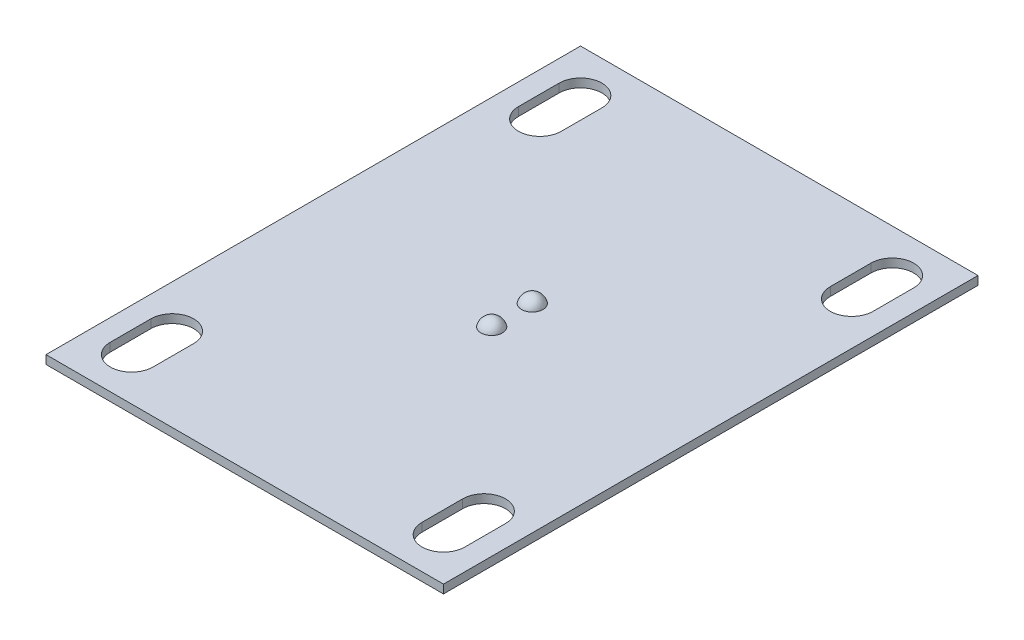
ISO-10303-21;
HEADER;
FILE_DESCRIPTION(('STEP AP214'),'2;1');
FILE_NAME('part.step','',(''),(''),'','','');
FILE_SCHEMA(('AUTOMOTIVE_DESIGN { 1 0 10303 214 1 1 1 1 }'));
ENDSEC;
DATA;
#1=APPLICATION_CONTEXT('core data for automotive mechanical design processes');
#2=APPLICATION_PROTOCOL_DEFINITION('international standard','automotive_design',2000,#1);
#3=PRODUCT_CONTEXT('',#1,'mechanical');
#4=PRODUCT('Part','Part','',(#3));
#5=PRODUCT_RELATED_PRODUCT_CATEGORY('part','',(#4));
#6=PRODUCT_DEFINITION_FORMATION('','',#4);
#7=PRODUCT_DEFINITION_CONTEXT('part definition',#1,'design');
#8=PRODUCT_DEFINITION('design','',#6,#7);
#9=PRODUCT_DEFINITION_SHAPE('','',#8);
#10=(LENGTH_UNIT() NAMED_UNIT(*) SI_UNIT(.MILLI.,.METRE.));
#11=(NAMED_UNIT(*) PLANE_ANGLE_UNIT() SI_UNIT($,.RADIAN.));
#12=(NAMED_UNIT(*) SI_UNIT($,.STERADIAN.) SOLID_ANGLE_UNIT());
#13=UNCERTAINTY_MEASURE_WITH_UNIT(LENGTH_MEASURE(1.E-05),#10,'distance_accuracy_value','');
#14=(GEOMETRIC_REPRESENTATION_CONTEXT(3) GLOBAL_UNCERTAINTY_ASSIGNED_CONTEXT((#13)) GLOBAL_UNIT_ASSIGNED_CONTEXT((#10,
#11,#12)) REPRESENTATION_CONTEXT('',''));
#15=CARTESIAN_POINT('',(0.,0.,0.));
#16=DIRECTION('',(0.,0.,1.));
#17=DIRECTION('',(1.,0.,0.));
#18=AXIS2_PLACEMENT_3D('',#15,#16,#17);
#19=CARTESIAN_POINT('',(0.,-4.3,0.));
#20=DIRECTION('',(0.,-1.,0.));
#21=DIRECTION('',(0.,0.,-1.));
#22=AXIS2_PLACEMENT_3D('',#19,#20,#21);
#23=PLANE('',#22);
#24=CARTESIAN_POINT('',(-35.4,-4.30000000000003,-37.0487989725326));
#25=DIRECTION('',(0.,1.,0.));
#26=DIRECTION('',(0.,0.,1.));
#27=AXIS2_PLACEMENT_3D('',#24,#25,#26);
#28=CIRCLE('',#27,5.);
#29=CARTESIAN_POINT('',(-30.4,-4.30000000000003,-37.0487989725326));
#30=VERTEX_POINT('',#29);
#31=CARTESIAN_POINT('',(-40.4,-4.30000000000003,-37.0487989725326));
#32=VERTEX_POINT('',#31);
#33=EDGE_CURVE('E236',#30,#32,#28,.T.);
#34=ORIENTED_EDGE('',*,*,#33,.T.);
#35=DIRECTION('',(0.,0.,1.));
#36=VECTOR('',#35,1.);
#37=CARTESIAN_POINT('',(-40.4,-4.30000000000003,-37.0487989725326));
#38=LINE('',#37,#36);
#39=CARTESIAN_POINT('',(-40.4,-4.3,-27.5655854825326));
#40=VERTEX_POINT('',#39);
#41=EDGE_CURVE('E239',#32,#40,#38,.T.);
#42=ORIENTED_EDGE('',*,*,#41,.T.);
#43=CARTESIAN_POINT('',(-35.4,-4.30000000000003,-27.5655854825326));
#44=DIRECTION('',(0.,1.,0.));
#45=DIRECTION('',(0.,0.,1.));
#46=AXIS2_PLACEMENT_3D('',#43,#44,#45);
#47=CIRCLE('',#46,5.00000000000001);
#48=CARTESIAN_POINT('',(-30.4,-4.30000000000003,-27.5655854825326));
#49=VERTEX_POINT('',#48);
#50=EDGE_CURVE('E243',#40,#49,#47,.T.);
#51=ORIENTED_EDGE('',*,*,#50,.T.);
#52=DIRECTION('',(0.,0.,-1.));
#53=VECTOR('',#52,1.);
#54=CARTESIAN_POINT('',(-30.4,-4.30000000000003,-37.0487989725326));
#55=LINE('',#54,#53);
#56=EDGE_CURVE('E246',#49,#30,#55,.T.);
#57=ORIENTED_EDGE('',*,*,#56,.T.);
#58=EDGE_LOOP('',(#34,#42,#51,#57));
#59=FACE_BOUND('',#58,.T.);
#60=CARTESIAN_POINT('',(-35.4,-4.30000000000001,58.2679875374674));
#61=DIRECTION('',(0.,1.,0.));
#62=DIRECTION('',(0.,0.,1.));
#63=AXIS2_PLACEMENT_3D('',#60,#61,#62);
#64=CIRCLE('',#63,5.);
#65=CARTESIAN_POINT('',(-30.4,-4.30000000000001,58.2679875374674));
#66=VERTEX_POINT('',#65);
#67=CARTESIAN_POINT('',(-40.4,-4.30000000000001,58.2679875374674));
#68=VERTEX_POINT('',#67);
#69=EDGE_CURVE('E270',#66,#68,#64,.T.);
#70=ORIENTED_EDGE('',*,*,#69,.T.);
#71=DIRECTION('',(0.,0.,1.));
#72=VECTOR('',#71,1.);
#73=CARTESIAN_POINT('',(-40.4,-4.30000000000001,58.2679875374674));
#74=LINE('',#73,#72);
#75=CARTESIAN_POINT('',(-40.4,-4.29999999999998,67.7512010274674));
#76=VERTEX_POINT('',#75);
#77=EDGE_CURVE('E273',#68,#76,#74,.T.);
#78=ORIENTED_EDGE('',*,*,#77,.T.);
#79=CARTESIAN_POINT('',(-35.4,-4.30000000000001,67.7512010274674));
#80=DIRECTION('',(0.,1.,0.));
#81=DIRECTION('',(0.,0.,1.));
#82=AXIS2_PLACEMENT_3D('',#79,#80,#81);
#83=CIRCLE('',#82,5.);
#84=CARTESIAN_POINT('',(-30.4,-4.30000000000001,67.7512010274674));
#85=VERTEX_POINT('',#84);
#86=EDGE_CURVE('E277',#76,#85,#83,.T.);
#87=ORIENTED_EDGE('',*,*,#86,.T.);
#88=DIRECTION('',(0.,0.,-1.));
#89=VECTOR('',#88,1.);
#90=CARTESIAN_POINT('',(-30.4,-4.30000000000001,58.2679875374674));
#91=LINE('',#90,#89);
#92=EDGE_CURVE('E280',#85,#66,#91,.T.);
#93=ORIENTED_EDGE('',*,*,#92,.T.);
#94=EDGE_LOOP('',(#70,#78,#87,#93));
#95=FACE_BOUND('',#94,.T.);
#96=DIRECTION('',(0.,0.,-1.));
#97=VECTOR('',#96,1.);
#98=CARTESIAN_POINT('',(-45.4,-4.29999999999998,77.7512010274674));
#99=LINE('',#98,#97);
#100=CARTESIAN_POINT('',(-45.4,-4.29999999999998,77.7512010274674));
#101=VERTEX_POINT('',#100);
#102=CARTESIAN_POINT('',(-45.4,-4.30000000000001,-47.0487989725326));
#103=VERTEX_POINT('',#102);
#104=EDGE_CURVE('E303',#101,#103,#99,.T.);
#105=ORIENTED_EDGE('',*,*,#104,.T.);
#106=DIRECTION('',(1.,0.,0.));
#107=VECTOR('',#106,1.);
#108=CARTESIAN_POINT('',(-45.4,-4.30000000000001,-47.0487989725326));
#109=LINE('',#108,#107);
#110=CARTESIAN_POINT('',(47.4,-4.30000000000001,-47.0487989725326));
#111=VERTEX_POINT('',#110);
#112=EDGE_CURVE('E306',#103,#111,#109,.T.);
#113=ORIENTED_EDGE('',*,*,#112,.T.);
#114=DIRECTION('',(0.,0.,1.));
#115=VECTOR('',#114,1.);
#116=CARTESIAN_POINT('',(47.4,-4.29999999999998,77.7512010274674));
#117=LINE('',#116,#115);
#118=CARTESIAN_POINT('',(47.4,-4.29999999999998,77.7512010274674));
#119=VERTEX_POINT('',#118);
#120=EDGE_CURVE('E309',#111,#119,#117,.T.);
#121=ORIENTED_EDGE('',*,*,#120,.T.);
#122=DIRECTION('',(-1.,0.,0.));
#123=VECTOR('',#122,1.);
#124=CARTESIAN_POINT('',(-45.4,-4.29999999999998,77.7512010274674));
#125=LINE('',#124,#123);
#126=EDGE_CURVE('E311',#119,#101,#125,.T.);
#127=ORIENTED_EDGE('',*,*,#126,.T.);
#128=EDGE_LOOP('',(#105,#113,#121,#127));
#129=FACE_BOUND('',#128,.T.);
#130=DIRECTION('',(0.,0.,1.));
#131=VECTOR('',#130,1.);
#132=CARTESIAN_POINT('',(42.3999999999999,-4.30000000000004,58.2679875374674));
#133=LINE('',#132,#131);
#134=CARTESIAN_POINT('',(42.3999999999999,-4.30000000000004,58.2679875374674));
#135=VERTEX_POINT('',#134);
#136=CARTESIAN_POINT('',(42.3999999999999,-4.30000000000004,67.7512010274674));
#137=VERTEX_POINT('',#136);
#138=EDGE_CURVE('E215',#135,#137,#133,.T.);
#139=ORIENTED_EDGE('',*,*,#138,.F.);
#140=CARTESIAN_POINT('',(37.3999999999999,-4.30000000000004,58.2679875374674));
#141=DIRECTION('',(0.,-1.,0.));
#142=DIRECTION('',(0.,0.,1.));
#143=AXIS2_PLACEMENT_3D('',#140,#141,#142);
#144=CIRCLE('',#143,5.);
#145=CARTESIAN_POINT('',(32.3999999999999,-4.30000000000004,58.2679875374674));
#146=VERTEX_POINT('',#145);
#147=EDGE_CURVE('E208',#146,#135,#144,.T.);
#148=ORIENTED_EDGE('',*,*,#147,.F.);
#149=DIRECTION('',(0.,0.,-1.));
#150=VECTOR('',#149,1.);
#151=CARTESIAN_POINT('',(32.3999999999999,-4.30000000000004,58.2679875374674));
#152=LINE('',#151,#150);
#153=CARTESIAN_POINT('',(32.3999999999999,-4.29999999999998,67.7512010274674));
#154=VERTEX_POINT('',#153);
#155=EDGE_CURVE('E210',#154,#146,#152,.T.);
#156=ORIENTED_EDGE('',*,*,#155,.F.);
#157=CARTESIAN_POINT('',(37.3999999999999,-4.30000000000004,67.7512010274674));
#158=DIRECTION('',(0.,-1.,0.));
#159=DIRECTION('',(0.,0.,1.));
#160=AXIS2_PLACEMENT_3D('',#157,#158,#159);
#161=CIRCLE('',#160,5.);
#162=EDGE_CURVE('E213',#137,#154,#161,.T.);
#163=ORIENTED_EDGE('',*,*,#162,.F.);
#164=EDGE_LOOP('',(#139,#148,#156,#163));
#165=FACE_BOUND('',#164,.T.);
#166=DIRECTION('',(0.,0.,1.));
#167=VECTOR('',#166,1.);
#168=CARTESIAN_POINT('',(42.3999999999999,-4.30000000000006,-37.0487989725326));
#169=LINE('',#168,#167);
#170=CARTESIAN_POINT('',(42.3999999999999,-4.30000000000006,-37.0487989725326));
#171=VERTEX_POINT('',#170);
#172=CARTESIAN_POINT('',(42.3999999999999,-4.30000000000006,-27.5655854825326));
#173=VERTEX_POINT('',#172);
#174=EDGE_CURVE('E185',#171,#173,#169,.T.);
#175=ORIENTED_EDGE('',*,*,#174,.F.);
#176=CARTESIAN_POINT('',(37.3999999999999,-4.30000000000006,-37.0487989725326));
#177=DIRECTION('',(0.,-1.,0.));
#178=DIRECTION('',(0.,0.,1.));
#179=AXIS2_PLACEMENT_3D('',#176,#177,#178);
#180=CIRCLE('',#179,5.);
#181=CARTESIAN_POINT('',(32.3999999999999,-4.30000000000006,-37.0487989725326));
#182=VERTEX_POINT('',#181);
#183=EDGE_CURVE('E177',#182,#171,#180,.T.);
#184=ORIENTED_EDGE('',*,*,#183,.F.);
#185=DIRECTION('',(0.,0.,-1.));
#186=VECTOR('',#185,1.);
#187=CARTESIAN_POINT('',(32.3999999999999,-4.30000000000006,-37.0487989725326));
#188=LINE('',#187,#186);
#189=CARTESIAN_POINT('',(32.3999999999999,-4.3,-27.5655854825326));
#190=VERTEX_POINT('',#189);
#191=EDGE_CURVE('E168',#190,#182,#188,.T.);
#192=ORIENTED_EDGE('',*,*,#191,.F.);
#193=CARTESIAN_POINT('',(37.3999999999999,-4.30000000000006,-27.5655854825326));
#194=DIRECTION('',(0.,-1.,0.));
#195=DIRECTION('',(0.,0.,1.));
#196=AXIS2_PLACEMENT_3D('',#193,#194,#195);
#197=CIRCLE('',#196,5.00000000000001);
#198=EDGE_CURVE('E176',#173,#190,#197,.T.);
#199=ORIENTED_EDGE('',*,*,#198,.F.);
#200=EDGE_LOOP('',(#175,#184,#192,#199));
#201=FACE_BOUND('',#200,.T.);
#202=ADVANCED_FACE('F32',(#59,#95,#129,#165,#201),#23,.T.);
#203=CARTESIAN_POINT('',(0.,-2.3,0.));
#204=DIRECTION('',(0.,-1.,0.));
#205=DIRECTION('',(0.,0.,-1.));
#206=AXIS2_PLACEMENT_3D('',#203,#204,#205);
#207=PLANE('',#206);
#208=CARTESIAN_POINT('',(37.3999999999999,-2.29999999999999,58.2679875374674));
#209=DIRECTION('',(0.,-1.,0.));
#210=DIRECTION('',(0.,0.,1.));
#211=AXIS2_PLACEMENT_3D('',#208,#209,#210);
#212=CIRCLE('',#211,5.);
#213=CARTESIAN_POINT('',(32.3999999999999,-2.29999999999999,58.2679875374674));
#214=VERTEX_POINT('',#213);
#215=CARTESIAN_POINT('',(42.3999999999999,-2.29999999999999,58.2679875374674));
#216=VERTEX_POINT('',#215);
#217=EDGE_CURVE('E218',#214,#216,#212,.T.);
#218=ORIENTED_EDGE('',*,*,#217,.T.);
#219=DIRECTION('',(0.,0.,1.));
#220=VECTOR('',#219,1.);
#221=CARTESIAN_POINT('',(42.3999999999999,-2.29999999999999,58.2679875374674));
#222=LINE('',#221,#220);
#223=CARTESIAN_POINT('',(42.3999999999999,-2.29999999999998,67.7512010274674));
#224=VERTEX_POINT('',#223);
#225=EDGE_CURVE('E211',#216,#224,#222,.T.);
#226=ORIENTED_EDGE('',*,*,#225,.T.);
#227=CARTESIAN_POINT('',(37.3999999999999,-2.29999999999998,67.7512010274674));
#228=DIRECTION('',(0.,-1.,0.));
#229=DIRECTION('',(0.,0.,1.));
#230=AXIS2_PLACEMENT_3D('',#227,#228,#229);
#231=CIRCLE('',#230,5.);
#232=CARTESIAN_POINT('',(32.3999999999999,-2.29999999999998,67.7512010274674));
#233=VERTEX_POINT('',#232);
#234=EDGE_CURVE('E224',#224,#233,#231,.T.);
#235=ORIENTED_EDGE('',*,*,#234,.T.);
#236=DIRECTION('',(0.,0.,-1.));
#237=VECTOR('',#236,1.);
#238=CARTESIAN_POINT('',(32.3999999999999,-2.29999999999999,58.2679875374674));
#239=LINE('',#238,#237);
#240=EDGE_CURVE('E221',#233,#214,#239,.T.);
#241=ORIENTED_EDGE('',*,*,#240,.T.);
#242=EDGE_LOOP('',(#218,#226,#235,#241));
#243=FACE_BOUND('',#242,.T.);
#244=DIRECTION('',(0.,0.,1.));
#245=VECTOR('',#244,1.);
#246=CARTESIAN_POINT('',(-40.4,-2.30000000000001,-37.0487989725326));
#247=LINE('',#246,#245);
#248=CARTESIAN_POINT('',(-40.4,-2.30000000000001,-37.0487989725326));
#249=VERTEX_POINT('',#248);
#250=CARTESIAN_POINT('',(-40.4,-2.3,-27.5655854825326));
#251=VERTEX_POINT('',#250);
#252=EDGE_CURVE('E252',#249,#251,#247,.T.);
#253=ORIENTED_EDGE('',*,*,#252,.F.);
#254=CARTESIAN_POINT('',(-35.4,-2.30000000000001,-37.0487989725326));
#255=DIRECTION('',(0.,1.,0.));
#256=DIRECTION('',(0.,0.,1.));
#257=AXIS2_PLACEMENT_3D('',#254,#255,#256);
#258=CIRCLE('',#257,5.);
#259=CARTESIAN_POINT('',(-30.4,-2.30000000000001,-37.0487989725326));
#260=VERTEX_POINT('',#259);
#261=EDGE_CURVE('E250',#260,#249,#258,.T.);
#262=ORIENTED_EDGE('',*,*,#261,.F.);
#263=DIRECTION('',(0.,0.,-1.));
#264=VECTOR('',#263,1.);
#265=CARTESIAN_POINT('',(-30.4,-2.30000000000001,-37.0487989725326));
#266=LINE('',#265,#264);
#267=CARTESIAN_POINT('',(-30.4,-2.3,-27.5655854825326));
#268=VERTEX_POINT('',#267);
#269=EDGE_CURVE('E240',#268,#260,#266,.T.);
#270=ORIENTED_EDGE('',*,*,#269,.F.);
#271=CARTESIAN_POINT('',(-35.4,-2.3,-27.5655854825326));
#272=DIRECTION('',(0.,1.,0.));
#273=DIRECTION('',(0.,0.,1.));
#274=AXIS2_PLACEMENT_3D('',#271,#272,#273);
#275=CIRCLE('',#274,5.00000000000001);
#276=EDGE_CURVE('E256',#251,#268,#275,.T.);
#277=ORIENTED_EDGE('',*,*,#276,.F.);
#278=EDGE_LOOP('',(#253,#262,#270,#277));
#279=FACE_BOUND('',#278,.T.);
#280=DIRECTION('',(0.,0.,1.));
#281=VECTOR('',#280,1.);
#282=CARTESIAN_POINT('',(-40.4,-2.29999999999999,58.2679875374674));
#283=LINE('',#282,#281);
#284=CARTESIAN_POINT('',(-40.4,-2.29999999999999,58.2679875374674));
#285=VERTEX_POINT('',#284);
#286=CARTESIAN_POINT('',(-40.4,-2.29999999999998,67.7512010274674));
#287=VERTEX_POINT('',#286);
#288=EDGE_CURVE('E285',#285,#287,#283,.T.);
#289=ORIENTED_EDGE('',*,*,#288,.F.);
#290=CARTESIAN_POINT('',(-35.4,-2.29999999999999,58.2679875374674));
#291=DIRECTION('',(0.,1.,0.));
#292=DIRECTION('',(0.,0.,1.));
#293=AXIS2_PLACEMENT_3D('',#290,#291,#292);
#294=CIRCLE('',#293,5.);
#295=CARTESIAN_POINT('',(-30.4,-2.29999999999999,58.2679875374674));
#296=VERTEX_POINT('',#295);
#297=EDGE_CURVE('E204',#296,#285,#294,.T.);
#298=ORIENTED_EDGE('',*,*,#297,.F.);
#299=DIRECTION('',(0.,0.,-1.));
#300=VECTOR('',#299,1.);
#301=CARTESIAN_POINT('',(-30.4,-2.29999999999999,58.2679875374674));
#302=LINE('',#301,#300);
#303=CARTESIAN_POINT('',(-30.4,-2.29999999999998,67.7512010274674));
#304=VERTEX_POINT('',#303);
#305=EDGE_CURVE('E274',#304,#296,#302,.T.);
#306=ORIENTED_EDGE('',*,*,#305,.F.);
#307=CARTESIAN_POINT('',(-35.4,-2.29999999999998,67.7512010274674));
#308=DIRECTION('',(0.,1.,0.));
#309=DIRECTION('',(0.,0.,1.));
#310=AXIS2_PLACEMENT_3D('',#307,#308,#309);
#311=CIRCLE('',#310,5.);
#312=EDGE_CURVE('E288',#287,#304,#311,.T.);
#313=ORIENTED_EDGE('',*,*,#312,.F.);
#314=EDGE_LOOP('',(#289,#298,#306,#313));
#315=FACE_BOUND('',#314,.T.);
#316=CARTESIAN_POINT('',(0.999999999999934,-2.29999999999999,20.10120103));
#317=DIRECTION('',(0.,-1.,0.));
#318=DIRECTION('',(0.,0.,-1.));
#319=AXIS2_PLACEMENT_3D('',#316,#317,#318);
#320=CIRCLE('',#319,2.5);
#321=CARTESIAN_POINT('',(0.999999999999934,-2.29999999999999,17.60120103));
#322=VERTEX_POINT('',#321);
#323=EDGE_CURVE('E11',#322,#322,#320,.F.);
#324=ORIENTED_EDGE('',*,*,#323,.F.);
#325=EDGE_LOOP('',(#324));
#326=FACE_BOUND('',#325,.T.);
#327=CARTESIAN_POINT('',(0.999999999999933,-2.3,10.61798754));
#328=DIRECTION('',(0.,1.,0.));
#329=DIRECTION('',(0.,0.,1.));
#330=AXIS2_PLACEMENT_3D('',#327,#328,#329);
#331=CIRCLE('',#330,2.5);
#332=CARTESIAN_POINT('',(0.999999999999933,-2.3,13.11798754));
#333=VERTEX_POINT('',#332);
#334=EDGE_CURVE('E263',#333,#333,#331,.T.);
#335=ORIENTED_EDGE('',*,*,#334,.F.);
#336=EDGE_LOOP('',(#335));
#337=FACE_BOUND('',#336,.T.);
#338=DIRECTION('',(0.,0.,-1.));
#339=VECTOR('',#338,1.);
#340=CARTESIAN_POINT('',(-45.4,-2.29999999999998,77.7512010274674));
#341=LINE('',#340,#339);
#342=CARTESIAN_POINT('',(-45.4,-2.29999999999998,77.7512010274674));
#343=VERTEX_POINT('',#342);
#344=CARTESIAN_POINT('',(-45.4,-2.30000000000001,-47.0487989725326));
#345=VERTEX_POINT('',#344);
#346=EDGE_CURVE('E302',#343,#345,#341,.T.);
#347=ORIENTED_EDGE('',*,*,#346,.F.);
#348=DIRECTION('',(-1.,0.,0.));
#349=VECTOR('',#348,1.);
#350=CARTESIAN_POINT('',(-45.4,-2.29999999999998,77.7512010274674));
#351=LINE('',#350,#349);
#352=CARTESIAN_POINT('',(47.4,-2.29999999999998,77.7512010274674));
#353=VERTEX_POINT('',#352);
#354=EDGE_CURVE('E307',#353,#343,#351,.T.);
#355=ORIENTED_EDGE('',*,*,#354,.F.);
#356=DIRECTION('',(0.,0.,1.));
#357=VECTOR('',#356,1.);
#358=CARTESIAN_POINT('',(47.4,-2.29999999999998,77.7512010274674));
#359=LINE('',#358,#357);
#360=CARTESIAN_POINT('',(47.4,-2.30000000000001,-47.0487989725326));
#361=VERTEX_POINT('',#360);
#362=EDGE_CURVE('E318',#361,#353,#359,.T.);
#363=ORIENTED_EDGE('',*,*,#362,.F.);
#364=DIRECTION('',(1.,0.,0.));
#365=VECTOR('',#364,1.);
#366=CARTESIAN_POINT('',(-45.4,-2.30000000000001,-47.0487989725326));
#367=LINE('',#366,#365);
#368=EDGE_CURVE('E316',#345,#361,#367,.T.);
#369=ORIENTED_EDGE('',*,*,#368,.F.);
#370=EDGE_LOOP('',(#347,#355,#363,#369));
#371=FACE_BOUND('',#370,.T.);
#372=CARTESIAN_POINT('',(37.3999999999999,-2.30000000000001,-37.0487989725326));
#373=DIRECTION('',(0.,-1.,0.));
#374=DIRECTION('',(0.,0.,1.));
#375=AXIS2_PLACEMENT_3D('',#372,#373,#374);
#376=CIRCLE('',#375,5.);
#377=CARTESIAN_POINT('',(32.3999999999999,-2.30000000000001,-37.0487989725326));
#378=VERTEX_POINT('',#377);
#379=CARTESIAN_POINT('',(42.3999999999999,-2.30000000000001,-37.0487989725326));
#380=VERTEX_POINT('',#379);
#381=EDGE_CURVE('E184',#378,#380,#376,.T.);
#382=ORIENTED_EDGE('',*,*,#381,.T.);
#383=DIRECTION('',(0.,0.,1.));
#384=VECTOR('',#383,1.);
#385=CARTESIAN_POINT('',(42.3999999999999,-2.30000000000001,-37.0487989725326));
#386=LINE('',#385,#384);
#387=CARTESIAN_POINT('',(42.3999999999999,-2.3,-27.5655854825326));
#388=VERTEX_POINT('',#387);
#389=EDGE_CURVE('E188',#380,#388,#386,.T.);
#390=ORIENTED_EDGE('',*,*,#389,.T.);
#391=CARTESIAN_POINT('',(37.3999999999999,-2.3,-27.5655854825326));
#392=DIRECTION('',(0.,-1.,0.));
#393=DIRECTION('',(0.,0.,1.));
#394=AXIS2_PLACEMENT_3D('',#391,#392,#393);
#395=CIRCLE('',#394,5.00000000000001);
#396=CARTESIAN_POINT('',(32.3999999999999,-2.3,-27.5655854825326));
#397=VERTEX_POINT('',#396);
#398=EDGE_CURVE('E191',#388,#397,#395,.T.);
#399=ORIENTED_EDGE('',*,*,#398,.T.);
#400=DIRECTION('',(0.,0.,-1.));
#401=VECTOR('',#400,1.);
#402=CARTESIAN_POINT('',(32.3999999999999,-2.30000000000001,-37.0487989725326));
#403=LINE('',#402,#401);
#404=EDGE_CURVE('E197',#397,#378,#403,.T.);
#405=ORIENTED_EDGE('',*,*,#404,.T.);
#406=EDGE_LOOP('',(#382,#390,#399,#405));
#407=FACE_BOUND('',#406,.T.);
#408=ADVANCED_FACE('F339',(#243,#279,#315,#326,#337,#371,#407),#207,.F.);
#409=CARTESIAN_POINT('',(-45.4,-4.29999999999998,77.7512010274674));
#410=DIRECTION('',(1.,0.,0.));
#411=DIRECTION('',(0.,0.,-1.));
#412=AXIS2_PLACEMENT_3D('',#409,#410,#411);
#413=PLANE('',#412);
#414=ORIENTED_EDGE('',*,*,#346,.T.);
#415=DIRECTION('',(0.,1.,0.));
#416=VECTOR('',#415,1.);
#417=CARTESIAN_POINT('',(-45.4,-4.30000000000001,-47.0487989725326));
#418=LINE('',#417,#416);
#419=EDGE_CURVE('E40',#103,#345,#418,.T.);
#420=ORIENTED_EDGE('',*,*,#419,.F.);
#421=ORIENTED_EDGE('',*,*,#104,.F.);
#422=DIRECTION('',(0.,1.,0.));
#423=VECTOR('',#422,1.);
#424=CARTESIAN_POINT('',(-45.4,-4.29999999999998,77.7512010274674));
#425=LINE('',#424,#423);
#426=EDGE_CURVE('E313',#101,#343,#425,.T.);
#427=ORIENTED_EDGE('',*,*,#426,.T.);
#428=EDGE_LOOP('',(#414,#420,#421,#427));
#429=FACE_BOUND('',#428,.T.);
#430=ADVANCED_FACE('F34',(#429),#413,.F.);
#431=CARTESIAN_POINT('',(-45.4,-4.30000000000001,-47.0487989725326));
#432=DIRECTION('',(0.,0.,1.));
#433=DIRECTION('',(0.,-1.,0.));
#434=AXIS2_PLACEMENT_3D('',#431,#432,#433);
#435=PLANE('',#434);
#436=ORIENTED_EDGE('',*,*,#368,.T.);
#437=DIRECTION('',(0.,1.,0.));
#438=VECTOR('',#437,1.);
#439=CARTESIAN_POINT('',(47.4,-4.30000000000001,-47.0487989725326));
#440=LINE('',#439,#438);
#441=EDGE_CURVE('E326',#111,#361,#440,.T.);
#442=ORIENTED_EDGE('',*,*,#441,.F.);
#443=ORIENTED_EDGE('',*,*,#112,.F.);
#444=ORIENTED_EDGE('',*,*,#419,.T.);
#445=EDGE_LOOP('',(#436,#442,#443,#444));
#446=FACE_BOUND('',#445,.T.);
#447=ADVANCED_FACE('F331',(#446),#435,.F.);
#448=CARTESIAN_POINT('',(47.4,-4.29999999999998,77.7512010274674));
#449=DIRECTION('',(-1.,0.,0.));
#450=DIRECTION('',(0.,0.,1.));
#451=AXIS2_PLACEMENT_3D('',#448,#449,#450);
#452=PLANE('',#451);
#453=ORIENTED_EDGE('',*,*,#362,.T.);
#454=DIRECTION('',(0.,1.,0.));
#455=VECTOR('',#454,1.);
#456=CARTESIAN_POINT('',(47.4,-4.29999999999998,77.7512010274674));
#457=LINE('',#456,#455);
#458=EDGE_CURVE('E323',#119,#353,#457,.T.);
#459=ORIENTED_EDGE('',*,*,#458,.F.);
#460=ORIENTED_EDGE('',*,*,#120,.F.);
#461=ORIENTED_EDGE('',*,*,#441,.T.);
#462=EDGE_LOOP('',(#453,#459,#460,#461));
#463=FACE_BOUND('',#462,.T.);
#464=ADVANCED_FACE('F344',(#463),#452,.F.);
#465=CARTESIAN_POINT('',(-45.4,-4.29999999999998,77.7512010274674));
#466=DIRECTION('',(0.,0.,-1.));
#467=DIRECTION('',(0.,1.,0.));
#468=AXIS2_PLACEMENT_3D('',#465,#466,#467);
#469=PLANE('',#468);
#470=ORIENTED_EDGE('',*,*,#354,.T.);
#471=ORIENTED_EDGE('',*,*,#426,.F.);
#472=ORIENTED_EDGE('',*,*,#126,.F.);
#473=ORIENTED_EDGE('',*,*,#458,.T.);
#474=EDGE_LOOP('',(#470,#471,#472,#473));
#475=FACE_BOUND('',#474,.T.);
#476=ADVANCED_FACE('F348',(#475),#469,.F.);
#477=CARTESIAN_POINT('',(0.999999999999933,-2.8625,10.61798754));
#478=DIRECTION('',(0.,1.,0.));
#479=DIRECTION('',(0.,0.,1.));
#480=AXIS2_PLACEMENT_3D('',#477,#478,#479);
#481=SPHERICAL_SURFACE('',#480,2.5625);
#482=ORIENTED_EDGE('',*,*,#334,.T.);
#483=EDGE_LOOP('',(#482));
#484=FACE_BOUND('',#483,.T.);
#485=ADVANCED_FACE('F419',(#484),#481,.T.);
#486=CARTESIAN_POINT('',(0.999999999999934,-2.86249999999999,20.10120103));
#487=DIRECTION('',(0.,-1.,0.));
#488=DIRECTION('',(0.,0.,-1.));
#489=AXIS2_PLACEMENT_3D('',#486,#487,#488);
#490=SPHERICAL_SURFACE('',#489,2.5625);
#491=ORIENTED_EDGE('',*,*,#323,.T.);
#492=EDGE_LOOP('',(#491));
#493=FACE_BOUND('',#492,.T.);
#494=ADVANCED_FACE('F415',(#493),#490,.T.);
#495=CARTESIAN_POINT('',(-35.4,-4.30000000000001,58.2679875374674));
#496=DIRECTION('',(0.,1.,0.));
#497=DIRECTION('',(0.,0.,1.));
#498=AXIS2_PLACEMENT_3D('',#495,#496,#497);
#499=CYLINDRICAL_SURFACE('',#498,5.);
#500=ORIENTED_EDGE('',*,*,#297,.T.);
#501=DIRECTION('',(0.,1.,0.));
#502=VECTOR('',#501,1.);
#503=CARTESIAN_POINT('',(-40.4,-4.30000000000001,58.2679875374674));
#504=LINE('',#503,#502);
#505=EDGE_CURVE('E283',#68,#285,#504,.T.);
#506=ORIENTED_EDGE('',*,*,#505,.F.);
#507=ORIENTED_EDGE('',*,*,#69,.F.);
#508=DIRECTION('',(0.,1.,0.));
#509=VECTOR('',#508,1.);
#510=CARTESIAN_POINT('',(-30.4,-4.30000000000001,58.2679875374674));
#511=LINE('',#510,#509);
#512=EDGE_CURVE('E253',#66,#296,#511,.T.);
#513=ORIENTED_EDGE('',*,*,#512,.T.);
#514=EDGE_LOOP('',(#500,#506,#507,#513));
#515=FACE_BOUND('',#514,.T.);
#516=ADVANCED_FACE('F405',(#515),#499,.F.);
#517=CARTESIAN_POINT('',(-30.4,-4.30000000000001,58.2679875374674));
#518=DIRECTION('',(1.,0.,0.));
#519=DIRECTION('',(0.,0.,-1.));
#520=AXIS2_PLACEMENT_3D('',#517,#518,#519);
#521=PLANE('',#520);
#522=ORIENTED_EDGE('',*,*,#305,.T.);
#523=ORIENTED_EDGE('',*,*,#512,.F.);
#524=ORIENTED_EDGE('',*,*,#92,.F.);
#525=DIRECTION('',(0.,1.,0.));
#526=VECTOR('',#525,1.);
#527=CARTESIAN_POINT('',(-30.4,-4.30000000000001,67.7512010274674));
#528=LINE('',#527,#526);
#529=EDGE_CURVE('E294',#85,#304,#528,.T.);
#530=ORIENTED_EDGE('',*,*,#529,.T.);
#531=EDGE_LOOP('',(#522,#523,#524,#530));
#532=FACE_BOUND('',#531,.T.);
#533=ADVANCED_FACE('F401',(#532),#521,.F.);
#534=CARTESIAN_POINT('',(-35.4,-4.30000000000001,67.7512010274674));
#535=DIRECTION('',(0.,1.,0.));
#536=DIRECTION('',(0.,0.,1.));
#537=AXIS2_PLACEMENT_3D('',#534,#535,#536);
#538=CYLINDRICAL_SURFACE('',#537,5.);
#539=ORIENTED_EDGE('',*,*,#312,.T.);
#540=ORIENTED_EDGE('',*,*,#529,.F.);
#541=ORIENTED_EDGE('',*,*,#86,.F.);
#542=DIRECTION('',(0.,1.,0.));
#543=VECTOR('',#542,1.);
#544=CARTESIAN_POINT('',(-40.4,-4.30000000000001,67.7512010274674));
#545=LINE('',#544,#543);
#546=EDGE_CURVE('E296',#76,#287,#545,.T.);
#547=ORIENTED_EDGE('',*,*,#546,.T.);
#548=EDGE_LOOP('',(#539,#540,#541,#547));
#549=FACE_BOUND('',#548,.T.);
#550=ADVANCED_FACE('F404',(#549),#538,.F.);
#551=CARTESIAN_POINT('',(-40.4,-4.30000000000001,58.2679875374674));
#552=DIRECTION('',(-1.,0.,0.));
#553=DIRECTION('',(0.,0.,1.));
#554=AXIS2_PLACEMENT_3D('',#551,#552,#553);
#555=PLANE('',#554);
#556=ORIENTED_EDGE('',*,*,#288,.T.);
#557=ORIENTED_EDGE('',*,*,#546,.F.);
#558=ORIENTED_EDGE('',*,*,#77,.F.);
#559=ORIENTED_EDGE('',*,*,#505,.T.);
#560=EDGE_LOOP('',(#556,#557,#558,#559));
#561=FACE_BOUND('',#560,.T.);
#562=ADVANCED_FACE('F399',(#561),#555,.F.);
#563=CARTESIAN_POINT('',(-35.4,-4.30000000000003,-37.0487989725326));
#564=DIRECTION('',(0.,1.,0.));
#565=DIRECTION('',(0.,0.,1.));
#566=AXIS2_PLACEMENT_3D('',#563,#564,#565);
#567=CYLINDRICAL_SURFACE('',#566,5.);
#568=ORIENTED_EDGE('',*,*,#261,.T.);
#569=DIRECTION('',(0.,1.,0.));
#570=VECTOR('',#569,1.);
#571=CARTESIAN_POINT('',(-40.4,-4.30000000000003,-37.0487989725326));
#572=LINE('',#571,#570);
#573=EDGE_CURVE('E249',#32,#249,#572,.T.);
#574=ORIENTED_EDGE('',*,*,#573,.F.);
#575=ORIENTED_EDGE('',*,*,#33,.F.);
#576=DIRECTION('',(0.,1.,0.));
#577=VECTOR('',#576,1.);
#578=CARTESIAN_POINT('',(-30.4,-4.30000000000003,-37.0487989725326));
#579=LINE('',#578,#577);
#580=EDGE_CURVE('E261',#30,#260,#579,.T.);
#581=ORIENTED_EDGE('',*,*,#580,.T.);
#582=EDGE_LOOP('',(#568,#574,#575,#581));
#583=FACE_BOUND('',#582,.T.);
#584=ADVANCED_FACE('F389',(#583),#567,.F.);
#585=CARTESIAN_POINT('',(-30.4,-4.30000000000003,-37.0487989725326));
#586=DIRECTION('',(1.,0.,0.));
#587=DIRECTION('',(0.,0.,-1.));
#588=AXIS2_PLACEMENT_3D('',#585,#586,#587);
#589=PLANE('',#588);
#590=ORIENTED_EDGE('',*,*,#269,.T.);
#591=ORIENTED_EDGE('',*,*,#580,.F.);
#592=ORIENTED_EDGE('',*,*,#56,.F.);
#593=DIRECTION('',(0.,1.,0.));
#594=VECTOR('',#593,1.);
#595=CARTESIAN_POINT('',(-30.4,-4.30000000000003,-27.5655854825326));
#596=LINE('',#595,#594);
#597=EDGE_CURVE('E264',#49,#268,#596,.T.);
#598=ORIENTED_EDGE('',*,*,#597,.T.);
#599=EDGE_LOOP('',(#590,#591,#592,#598));
#600=FACE_BOUND('',#599,.T.);
#601=ADVANCED_FACE('F385',(#600),#589,.F.);
#602=CARTESIAN_POINT('',(-35.4,-4.30000000000003,-27.5655854825326));
#603=DIRECTION('',(0.,1.,0.));
#604=DIRECTION('',(0.,0.,1.));
#605=AXIS2_PLACEMENT_3D('',#602,#603,#604);
#606=CYLINDRICAL_SURFACE('',#605,5.00000000000001);
#607=ORIENTED_EDGE('',*,*,#276,.T.);
#608=ORIENTED_EDGE('',*,*,#597,.F.);
#609=ORIENTED_EDGE('',*,*,#50,.F.);
#610=DIRECTION('',(0.,1.,0.));
#611=VECTOR('',#610,1.);
#612=CARTESIAN_POINT('',(-40.4,-4.30000000000003,-27.5655854825326));
#613=LINE('',#612,#611);
#614=EDGE_CURVE('E266',#40,#251,#613,.T.);
#615=ORIENTED_EDGE('',*,*,#614,.T.);
#616=EDGE_LOOP('',(#607,#608,#609,#615));
#617=FACE_BOUND('',#616,.T.);
#618=ADVANCED_FACE('F388',(#617),#606,.F.);
#619=CARTESIAN_POINT('',(-40.4,-4.30000000000003,-37.0487989725326));
#620=DIRECTION('',(-1.,0.,0.));
#621=DIRECTION('',(0.,0.,1.));
#622=AXIS2_PLACEMENT_3D('',#619,#620,#621);
#623=PLANE('',#622);
#624=ORIENTED_EDGE('',*,*,#252,.T.);
#625=ORIENTED_EDGE('',*,*,#614,.F.);
#626=ORIENTED_EDGE('',*,*,#41,.F.);
#627=ORIENTED_EDGE('',*,*,#573,.T.);
#628=EDGE_LOOP('',(#624,#625,#626,#627));
#629=FACE_BOUND('',#628,.T.);
#630=ADVANCED_FACE('F384',(#629),#623,.F.);
#631=CARTESIAN_POINT('',(37.3999999999999,-4.30000000000004,58.2679875374674));
#632=DIRECTION('',(0.,1.,0.));
#633=DIRECTION('',(0.,0.,1.));
#634=AXIS2_PLACEMENT_3D('',#631,#632,#633);
#635=CYLINDRICAL_SURFACE('',#634,5.);
#636=ORIENTED_EDGE('',*,*,#217,.F.);
#637=DIRECTION('',(0.,1.,0.));
#638=VECTOR('',#637,1.);
#639=CARTESIAN_POINT('',(32.3999999999999,-4.30000000000004,58.2679875374674));
#640=LINE('',#639,#638);
#641=EDGE_CURVE('E217',#146,#214,#640,.T.);
#642=ORIENTED_EDGE('',*,*,#641,.F.);
#643=ORIENTED_EDGE('',*,*,#147,.T.);
#644=DIRECTION('',(0.,1.,0.));
#645=VECTOR('',#644,1.);
#646=CARTESIAN_POINT('',(42.3999999999999,-4.30000000000004,58.2679875374674));
#647=LINE('',#646,#645);
#648=EDGE_CURVE('E198',#135,#216,#647,.T.);
#649=ORIENTED_EDGE('',*,*,#648,.T.);
#650=EDGE_LOOP('',(#636,#642,#643,#649));
#651=FACE_BOUND('',#650,.T.);
#652=ADVANCED_FACE('F368',(#651),#635,.F.);
#653=CARTESIAN_POINT('',(42.3999999999999,-4.30000000000004,58.2679875374674));
#654=DIRECTION('',(-1.,0.,0.));
#655=DIRECTION('',(0.,0.,1.));
#656=AXIS2_PLACEMENT_3D('',#653,#654,#655);
#657=PLANE('',#656);
#658=ORIENTED_EDGE('',*,*,#225,.F.);
#659=ORIENTED_EDGE('',*,*,#648,.F.);
#660=ORIENTED_EDGE('',*,*,#138,.T.);
#661=DIRECTION('',(0.,1.,0.));
#662=VECTOR('',#661,1.);
#663=CARTESIAN_POINT('',(42.3999999999999,-4.30000000000004,67.7512010274674));
#664=LINE('',#663,#662);
#665=EDGE_CURVE('E231',#137,#224,#664,.T.);
#666=ORIENTED_EDGE('',*,*,#665,.T.);
#667=EDGE_LOOP('',(#658,#659,#660,#666));
#668=FACE_BOUND('',#667,.T.);
#669=ADVANCED_FACE('F361',(#668),#657,.T.);
#670=CARTESIAN_POINT('',(37.3999999999999,-4.30000000000004,67.7512010274674));
#671=DIRECTION('',(0.,1.,0.));
#672=DIRECTION('',(0.,0.,1.));
#673=AXIS2_PLACEMENT_3D('',#670,#671,#672);
#674=CYLINDRICAL_SURFACE('',#673,5.);
#675=ORIENTED_EDGE('',*,*,#234,.F.);
#676=ORIENTED_EDGE('',*,*,#665,.F.);
#677=ORIENTED_EDGE('',*,*,#162,.T.);
#678=DIRECTION('',(0.,1.,0.));
#679=VECTOR('',#678,1.);
#680=CARTESIAN_POINT('',(32.3999999999999,-4.30000000000004,67.7512010274674));
#681=LINE('',#680,#679);
#682=EDGE_CURVE('E55',#154,#233,#681,.T.);
#683=ORIENTED_EDGE('',*,*,#682,.T.);
#684=EDGE_LOOP('',(#675,#676,#677,#683));
#685=FACE_BOUND('',#684,.T.);
#686=ADVANCED_FACE('F364',(#685),#674,.F.);
#687=CARTESIAN_POINT('',(32.3999999999999,-4.30000000000004,58.2679875374674));
#688=DIRECTION('',(1.,0.,0.));
#689=DIRECTION('',(0.,0.,-1.));
#690=AXIS2_PLACEMENT_3D('',#687,#688,#689);
#691=PLANE('',#690);
#692=ORIENTED_EDGE('',*,*,#240,.F.);
#693=ORIENTED_EDGE('',*,*,#682,.F.);
#694=ORIENTED_EDGE('',*,*,#155,.T.);
#695=ORIENTED_EDGE('',*,*,#641,.T.);
#696=EDGE_LOOP('',(#692,#693,#694,#695));
#697=FACE_BOUND('',#696,.T.);
#698=ADVANCED_FACE('F370',(#697),#691,.T.);
#699=CARTESIAN_POINT('',(37.3999999999999,-4.30000000000006,-37.0487989725326));
#700=DIRECTION('',(0.,1.,0.));
#701=DIRECTION('',(0.,0.,1.));
#702=AXIS2_PLACEMENT_3D('',#699,#700,#701);
#703=CYLINDRICAL_SURFACE('',#702,5.);
#704=ORIENTED_EDGE('',*,*,#381,.F.);
#705=DIRECTION('',(0.,1.,0.));
#706=VECTOR('',#705,1.);
#707=CARTESIAN_POINT('',(32.3999999999999,-4.30000000000006,-37.0487989725326));
#708=LINE('',#707,#706);
#709=EDGE_CURVE('E171',#182,#378,#708,.T.);
#710=ORIENTED_EDGE('',*,*,#709,.F.);
#711=ORIENTED_EDGE('',*,*,#183,.T.);
#712=DIRECTION('',(0.,1.,0.));
#713=VECTOR('',#712,1.);
#714=CARTESIAN_POINT('',(42.3999999999999,-4.30000000000006,-37.0487989725326));
#715=LINE('',#714,#713);
#716=EDGE_CURVE('E202',#171,#380,#715,.T.);
#717=ORIENTED_EDGE('',*,*,#716,.T.);
#718=EDGE_LOOP('',(#704,#710,#711,#717));
#719=FACE_BOUND('',#718,.T.);
#720=ADVANCED_FACE('F180',(#719),#703,.F.);
#721=CARTESIAN_POINT('',(42.3999999999999,-4.30000000000006,-37.0487989725326));
#722=DIRECTION('',(-1.,0.,0.));
#723=DIRECTION('',(0.,0.,1.));
#724=AXIS2_PLACEMENT_3D('',#721,#722,#723);
#725=PLANE('',#724);
#726=ORIENTED_EDGE('',*,*,#389,.F.);
#727=ORIENTED_EDGE('',*,*,#716,.F.);
#728=ORIENTED_EDGE('',*,*,#174,.T.);
#729=DIRECTION('',(0.,1.,0.));
#730=VECTOR('',#729,1.);
#731=CARTESIAN_POINT('',(42.3999999999999,-4.30000000000006,-27.5655854825326));
#732=LINE('',#731,#730);
#733=EDGE_CURVE('E205',#173,#388,#732,.T.);
#734=ORIENTED_EDGE('',*,*,#733,.T.);
#735=EDGE_LOOP('',(#726,#727,#728,#734));
#736=FACE_BOUND('',#735,.T.);
#737=ADVANCED_FACE('F377',(#736),#725,.T.);
#738=CARTESIAN_POINT('',(37.3999999999999,-4.30000000000006,-27.5655854825326));
#739=DIRECTION('',(0.,1.,0.));
#740=DIRECTION('',(0.,0.,1.));
#741=AXIS2_PLACEMENT_3D('',#738,#739,#740);
#742=CYLINDRICAL_SURFACE('',#741,5.00000000000001);
#743=ORIENTED_EDGE('',*,*,#398,.F.);
#744=ORIENTED_EDGE('',*,*,#733,.F.);
#745=ORIENTED_EDGE('',*,*,#198,.T.);
#746=DIRECTION('',(0.,1.,0.));
#747=VECTOR('',#746,1.);
#748=CARTESIAN_POINT('',(32.3999999999999,-4.30000000000006,-27.5655854825326));
#749=LINE('',#748,#747);
#750=EDGE_CURVE('E47',#190,#397,#749,.T.);
#751=ORIENTED_EDGE('',*,*,#750,.T.);
#752=EDGE_LOOP('',(#743,#744,#745,#751));
#753=FACE_BOUND('',#752,.T.);
#754=ADVANCED_FACE('F555',(#753),#742,.F.);
#755=CARTESIAN_POINT('',(32.3999999999999,-4.30000000000006,-37.0487989725326));
#756=DIRECTION('',(1.,0.,0.));
#757=DIRECTION('',(0.,0.,-1.));
#758=AXIS2_PLACEMENT_3D('',#755,#756,#757);
#759=PLANE('',#758);
#760=ORIENTED_EDGE('',*,*,#404,.F.);
#761=ORIENTED_EDGE('',*,*,#750,.F.);
#762=ORIENTED_EDGE('',*,*,#191,.T.);
#763=ORIENTED_EDGE('',*,*,#709,.T.);
#764=EDGE_LOOP('',(#760,#761,#762,#763));
#765=FACE_BOUND('',#764,.T.);
#766=ADVANCED_FACE('F170',(#765),#759,.T.);
#767=CLOSED_SHELL('',(#202,#408,#430,#447,#464,#476,#485,#494,#516,#533,#550,#562,#584,#601,
#618,#630,#652,#669,#686,#698,#720,#737,#754,#766));
#768=MANIFOLD_SOLID_BREP('B2',#767);
#769=ADVANCED_BREP_SHAPE_REPRESENTATION('',(#18,#768),#14);
#770=SHAPE_DEFINITION_REPRESENTATION(#9,#769);
ENDSEC;
END-ISO-10303-21;
